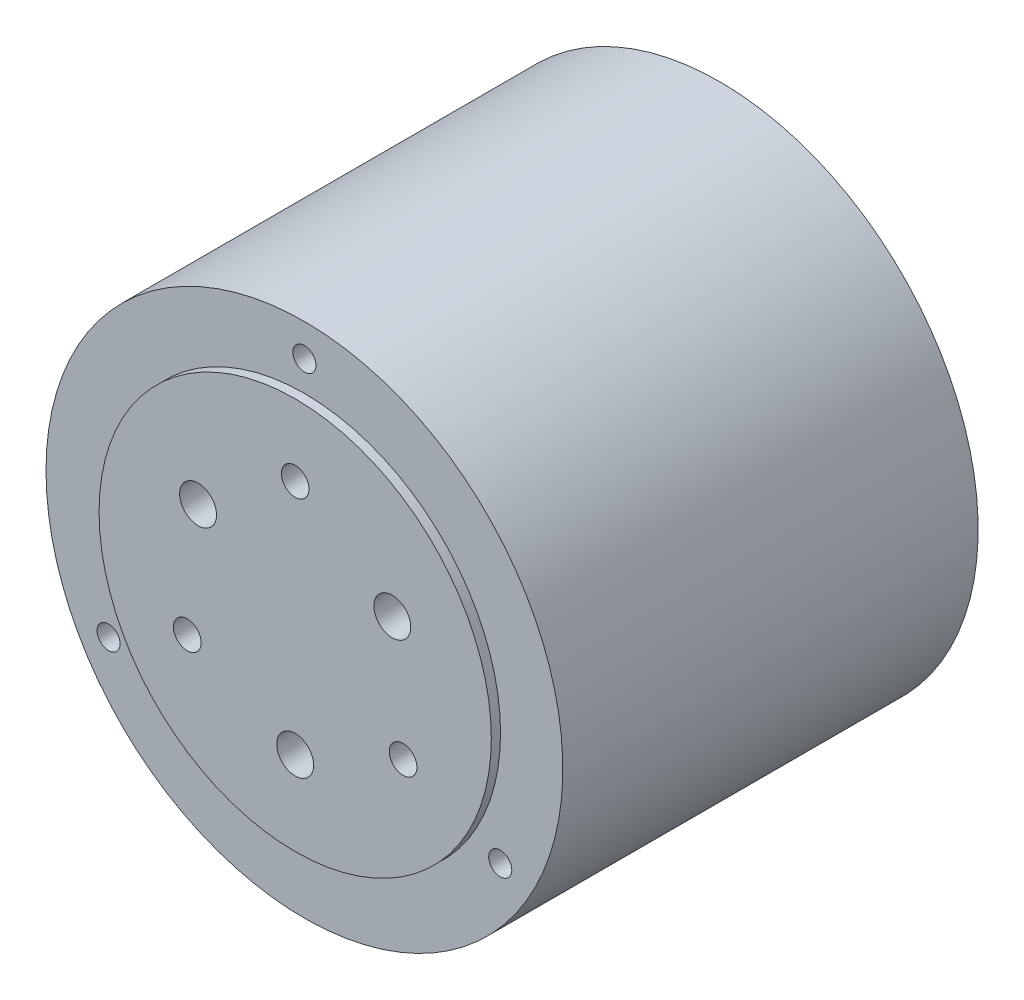
ISO-10303-21;
HEADER;
FILE_DESCRIPTION(('STEP AP214'),'2;1');
FILE_NAME('part.step','',(''),(''),'','','');
FILE_SCHEMA(('AUTOMOTIVE_DESIGN { 1 0 10303 214 1 1 1 1 }'));
ENDSEC;
DATA;
#1=APPLICATION_CONTEXT('core data for automotive mechanical design processes');
#2=APPLICATION_PROTOCOL_DEFINITION('international standard','automotive_design',2000,#1);
#3=PRODUCT_CONTEXT('',#1,'mechanical');
#4=PRODUCT('Part','Part','',(#3));
#5=PRODUCT_RELATED_PRODUCT_CATEGORY('part','',(#4));
#6=PRODUCT_DEFINITION_FORMATION('','',#4);
#7=PRODUCT_DEFINITION_CONTEXT('part definition',#1,'design');
#8=PRODUCT_DEFINITION('design','',#6,#7);
#9=PRODUCT_DEFINITION_SHAPE('','',#8);
#10=(LENGTH_UNIT() NAMED_UNIT(*) SI_UNIT(.MILLI.,.METRE.));
#11=(NAMED_UNIT(*) PLANE_ANGLE_UNIT() SI_UNIT($,.RADIAN.));
#12=(NAMED_UNIT(*) SI_UNIT($,.STERADIAN.) SOLID_ANGLE_UNIT());
#13=UNCERTAINTY_MEASURE_WITH_UNIT(LENGTH_MEASURE(1.E-05),#10,'distance_accuracy_value','');
#14=(GEOMETRIC_REPRESENTATION_CONTEXT(3) GLOBAL_UNCERTAINTY_ASSIGNED_CONTEXT((#13)) GLOBAL_UNIT_ASSIGNED_CONTEXT((#10,
#11,#12)) REPRESENTATION_CONTEXT('',''));
#15=CARTESIAN_POINT('',(0.,0.,0.));
#16=DIRECTION('',(0.,0.,1.));
#17=DIRECTION('',(1.,0.,0.));
#18=AXIS2_PLACEMENT_3D('',#15,#16,#17);
#19=CARTESIAN_POINT('',(0.,0.,45.));
#20=DIRECTION('',(0.,0.,-1.));
#21=DIRECTION('',(-1.,0.,0.));
#22=AXIS2_PLACEMENT_3D('',#19,#20,#21);
#23=CYLINDRICAL_SURFACE('',#22,28.);
#24=CARTESIAN_POINT('',(0.,0.,45.));
#25=DIRECTION('',(0.,0.,1.));
#26=DIRECTION('',(1.,0.,0.));
#27=AXIS2_PLACEMENT_3D('',#24,#25,#26);
#28=CIRCLE('',#27,28.);
#29=CARTESIAN_POINT('',(-28.,0.,45.));
#30=VERTEX_POINT('',#29);
#31=EDGE_CURVE('E10',#30,#30,#28,.T.);
#32=CARTESIAN_POINT('',(0.,0.,0.));
#33=DIRECTION('',(0.,0.,1.));
#34=DIRECTION('',(1.,0.,0.));
#35=AXIS2_PLACEMENT_3D('',#32,#33,#34);
#36=CIRCLE('',#35,28.);
#37=CARTESIAN_POINT('',(-28.,0.,0.));
#38=VERTEX_POINT('',#37);
#39=EDGE_CURVE('E44',#38,#38,#36,.T.);
#40=CARTESIAN_POINT('',(-28.,0.,45.));
#41=CARTESIAN_POINT('',(-28.,0.,44.53125));
#42=CARTESIAN_POINT('',(-28.,0.,44.0625));
#43=CARTESIAN_POINT('',(-28.,0.,43.125));
#44=CARTESIAN_POINT('',(-28.,0.,42.65625));
#45=CARTESIAN_POINT('',(-28.,0.,41.71875));
#46=CARTESIAN_POINT('',(-28.,0.,41.25));
#47=CARTESIAN_POINT('',(-28.,0.,40.3125));
#48=CARTESIAN_POINT('',(-28.,0.,39.84375));
#49=CARTESIAN_POINT('',(-28.,0.,38.90625));
#50=CARTESIAN_POINT('',(-28.,0.,38.4375));
#51=CARTESIAN_POINT('',(-28.,0.,37.5));
#52=CARTESIAN_POINT('',(-28.,0.,37.03125));
#53=CARTESIAN_POINT('',(-28.,0.,36.09375));
#54=CARTESIAN_POINT('',(-28.,0.,35.625));
#55=CARTESIAN_POINT('',(-28.,0.,34.6875));
#56=CARTESIAN_POINT('',(-28.,0.,34.21875));
#57=CARTESIAN_POINT('',(-28.,0.,33.28125));
#58=CARTESIAN_POINT('',(-28.,0.,32.8125));
#59=CARTESIAN_POINT('',(-28.,0.,31.875));
#60=CARTESIAN_POINT('',(-28.,0.,31.40625));
#61=CARTESIAN_POINT('',(-28.,0.,30.46875));
#62=CARTESIAN_POINT('',(-28.,0.,30.));
#63=CARTESIAN_POINT('',(-28.,0.,29.0625));
#64=CARTESIAN_POINT('',(-28.,0.,28.59375));
#65=CARTESIAN_POINT('',(-28.,0.,27.65625));
#66=CARTESIAN_POINT('',(-28.,0.,27.1875));
#67=CARTESIAN_POINT('',(-28.,0.,26.25));
#68=CARTESIAN_POINT('',(-28.,0.,25.78125));
#69=CARTESIAN_POINT('',(-28.,0.,24.84375));
#70=CARTESIAN_POINT('',(-28.,0.,24.375));
#71=CARTESIAN_POINT('',(-28.,0.,23.4375));
#72=CARTESIAN_POINT('',(-28.,0.,22.96875));
#73=CARTESIAN_POINT('',(-28.,0.,22.03125));
#74=CARTESIAN_POINT('',(-28.,0.,21.5625));
#75=CARTESIAN_POINT('',(-28.,0.,20.625));
#76=CARTESIAN_POINT('',(-28.,0.,20.15625));
#77=CARTESIAN_POINT('',(-28.,0.,19.21875));
#78=CARTESIAN_POINT('',(-28.,0.,18.75));
#79=CARTESIAN_POINT('',(-28.,0.,17.8125));
#80=CARTESIAN_POINT('',(-28.,0.,17.34375));
#81=CARTESIAN_POINT('',(-28.,0.,16.40625));
#82=CARTESIAN_POINT('',(-28.,0.,15.9375));
#83=CARTESIAN_POINT('',(-28.,0.,15.));
#84=CARTESIAN_POINT('',(-28.,0.,14.53125));
#85=CARTESIAN_POINT('',(-28.,0.,13.59375));
#86=CARTESIAN_POINT('',(-28.,0.,13.125));
#87=CARTESIAN_POINT('',(-28.,0.,12.1875));
#88=CARTESIAN_POINT('',(-28.,0.,11.71875));
#89=CARTESIAN_POINT('',(-28.,0.,10.78125));
#90=CARTESIAN_POINT('',(-28.,0.,10.3125));
#91=CARTESIAN_POINT('',(-28.,0.,9.37499999999999));
#92=CARTESIAN_POINT('',(-28.,0.,8.90624999999999));
#93=CARTESIAN_POINT('',(-28.,0.,7.96874999999999));
#94=CARTESIAN_POINT('',(-28.,0.,7.5));
#95=CARTESIAN_POINT('',(-28.,0.,6.56249999999999));
#96=CARTESIAN_POINT('',(-28.,0.,6.09374999999999));
#97=CARTESIAN_POINT('',(-28.,0.,5.15624999999999));
#98=CARTESIAN_POINT('',(-28.,0.,4.68749999999999));
#99=CARTESIAN_POINT('',(-28.,0.,3.74999999999999));
#100=CARTESIAN_POINT('',(-28.,0.,3.28124999999999));
#101=CARTESIAN_POINT('',(-28.,0.,2.34374999999999));
#102=CARTESIAN_POINT('',(-28.,0.,1.87499999999999));
#103=CARTESIAN_POINT('',(-28.,0.,0.937499999999992));
#104=CARTESIAN_POINT('',(-28.,0.,0.468749999999993));
#105=CARTESIAN_POINT('',(-28.,0.,0.));
#106=B_SPLINE_CURVE_WITH_KNOTS('',3,(#40,#41,#42,#43,#44,#45,#46,#47,#48,#49,#50,#51,#52,#53,
#54,#55,#56,#57,#58,#59,#60,#61,#62,#63,#64,#65,#66,#67,#68,#69,#70,#71,#72,#73,#74,#75,#76,#77,
#78,#79,#80,#81,#82,#83,#84,#85,#86,#87,#88,#89,#90,#91,#92,#93,#94,#95,#96,#97,#98,#99,#100,
#101,#102,#103,#104,#105),.UNSPECIFIED.,.F.,.F.,(4,2,2,2,2,2,2,2,2,2,2,2,2,2,2,2,2,2,2,2,2,2,2,
2,2,2,2,2,2,2,2,2,4),(0.,1.40625,2.8125,4.21874999999999,5.625,7.03125,8.43749999999999,9.84375,
11.25,12.65625,14.0625,15.46875,16.875,18.28125,19.6875,21.09375,22.5,23.90625,25.3125,26.71875,
28.125,29.53125,30.9375,32.34375,33.75,35.15625,36.5625,37.96875,39.375,40.78125,42.1875,
43.59375,45.),.UNSPECIFIED.);
#107=EDGE_CURVE('BSEAM41',#30,#38,#106,.T.);
#108=ORIENTED_EDGE('',*,*,#31,.F.);
#109=ORIENTED_EDGE('',*,*,#39,.T.);
#110=ORIENTED_EDGE('',*,*,#107,.T.);
#111=ORIENTED_EDGE('',*,*,#107,.F.);
#112=EDGE_LOOP('',(#108,#110,#109,#111));
#113=FACE_BOUND('',#112,.T.);
#114=ADVANCED_FACE('F41',(#113),#23,.T.);
#115=CARTESIAN_POINT('',(0.,0.,45.));
#116=DIRECTION('',(0.,0.,1.));
#117=DIRECTION('',(1.,0.,0.));
#118=AXIS2_PLACEMENT_3D('',#115,#116,#117);
#119=PLANE('',#118);
#120=CARTESIAN_POINT('',(0.,0.,45.));
#121=DIRECTION('',(0.,0.,1.));
#122=DIRECTION('',(1.,0.,0.));
#123=AXIS2_PLACEMENT_3D('',#120,#121,#122);
#124=CIRCLE('',#123,21.25);
#125=CARTESIAN_POINT('',(21.25,0.,45.));
#126=VERTEX_POINT('',#125);
#127=EDGE_CURVE('E111',#126,#126,#124,.T.);
#128=ORIENTED_EDGE('',*,*,#127,.F.);
#129=EDGE_LOOP('',(#128));
#130=FACE_BOUND('',#129,.T.);
#131=CARTESIAN_POINT('',(0.,24.5,45.));
#132=DIRECTION('',(0.,0.,1.));
#133=DIRECTION('',(1.,0.,0.));
#134=AXIS2_PLACEMENT_3D('',#131,#132,#133);
#135=CIRCLE('',#134,1.25);
#136=CARTESIAN_POINT('',(1.25,24.5,45.));
#137=VERTEX_POINT('',#136);
#138=EDGE_CURVE('E104',#137,#137,#135,.T.);
#139=ORIENTED_EDGE('',*,*,#138,.F.);
#140=EDGE_LOOP('',(#139));
#141=FACE_BOUND('',#140,.T.);
#142=CARTESIAN_POINT('',(21.2176223927188,-12.25,45.));
#143=DIRECTION('',(0.,0.,1.));
#144=DIRECTION('',(1.,0.,0.));
#145=AXIS2_PLACEMENT_3D('',#142,#143,#144);
#146=CIRCLE('',#145,1.25);
#147=CARTESIAN_POINT('',(22.4676223927188,-12.25,45.));
#148=VERTEX_POINT('',#147);
#149=EDGE_CURVE('E96',#148,#148,#146,.T.);
#150=ORIENTED_EDGE('',*,*,#149,.F.);
#151=EDGE_LOOP('',(#150));
#152=FACE_BOUND('',#151,.T.);
#153=CARTESIAN_POINT('',(-21.2176223927187,-12.25,45.));
#154=DIRECTION('',(0.,0.,1.));
#155=DIRECTION('',(1.,0.,0.));
#156=AXIS2_PLACEMENT_3D('',#153,#154,#155);
#157=CIRCLE('',#156,1.25);
#158=CARTESIAN_POINT('',(-19.9676223927187,-12.25,45.));
#159=VERTEX_POINT('',#158);
#160=EDGE_CURVE('E87',#159,#159,#157,.T.);
#161=ORIENTED_EDGE('',*,*,#160,.F.);
#162=EDGE_LOOP('',(#161));
#163=FACE_BOUND('',#162,.T.);
#164=ORIENTED_EDGE('',*,*,#31,.T.);
#165=EDGE_LOOP('',(#164));
#166=FACE_BOUND('',#165,.T.);
#167=ADVANCED_FACE('F200',(#130,#141,#152,#163,#166),#119,.T.);
#168=CARTESIAN_POINT('',(0.,0.,0.));
#169=DIRECTION('',(0.,0.,1.));
#170=DIRECTION('',(1.,0.,0.));
#171=AXIS2_PLACEMENT_3D('',#168,#169,#170);
#172=PLANE('',#171);
#173=CARTESIAN_POINT('',(-19.,0.,0.));
#174=DIRECTION('',(0.,0.,-1.));
#175=DIRECTION('',(-1.,0.,0.));
#176=AXIS2_PLACEMENT_3D('',#173,#174,#175);
#177=CIRCLE('',#176,1.25);
#178=CARTESIAN_POINT('',(-20.25,0.,0.));
#179=VERTEX_POINT('',#178);
#180=EDGE_CURVE('E80',#179,#179,#177,.T.);
#181=ORIENTED_EDGE('',*,*,#180,.F.);
#182=EDGE_LOOP('',(#181));
#183=FACE_BOUND('',#182,.T.);
#184=CARTESIAN_POINT('',(0.,-19.,0.));
#185=DIRECTION('',(0.,0.,-1.));
#186=DIRECTION('',(-1.,0.,0.));
#187=AXIS2_PLACEMENT_3D('',#184,#185,#186);
#188=CIRCLE('',#187,1.24999999999992);
#189=CARTESIAN_POINT('',(-1.24999999999992,-19.,0.));
#190=VERTEX_POINT('',#189);
#191=EDGE_CURVE('E72',#190,#190,#188,.T.);
#192=ORIENTED_EDGE('',*,*,#191,.F.);
#193=EDGE_LOOP('',(#192));
#194=FACE_BOUND('',#193,.T.);
#195=CARTESIAN_POINT('',(19.,1.32706345912226E-13,0.));
#196=DIRECTION('',(0.,0.,-1.));
#197=DIRECTION('',(-1.,0.,0.));
#198=AXIS2_PLACEMENT_3D('',#195,#196,#197);
#199=CIRCLE('',#198,1.25);
#200=CARTESIAN_POINT('',(17.75,1.32706345912226E-13,0.));
#201=VERTEX_POINT('',#200);
#202=EDGE_CURVE('E64',#201,#201,#199,.T.);
#203=ORIENTED_EDGE('',*,*,#202,.F.);
#204=EDGE_LOOP('',(#203));
#205=FACE_BOUND('',#204,.T.);
#206=CARTESIAN_POINT('',(-1.99059518868339E-13,19.,0.));
#207=DIRECTION('',(0.,0.,-1.));
#208=DIRECTION('',(-1.,0.,0.));
#209=AXIS2_PLACEMENT_3D('',#206,#207,#208);
#210=CIRCLE('',#209,1.25);
#211=CARTESIAN_POINT('',(-1.2500000000002,19.,0.));
#212=VERTEX_POINT('',#211);
#213=EDGE_CURVE('E55',#212,#212,#210,.T.);
#214=ORIENTED_EDGE('',*,*,#213,.F.);
#215=EDGE_LOOP('',(#214));
#216=FACE_BOUND('',#215,.T.);
#217=ORIENTED_EDGE('',*,*,#39,.F.);
#218=EDGE_LOOP('',(#217));
#219=FACE_BOUND('',#218,.T.);
#220=ADVANCED_FACE('F203',(#183,#194,#205,#216,#219),#172,.F.);
#221=CARTESIAN_POINT('',(-1.99059518868339E-13,19.,4.));
#222=DIRECTION('',(0.,0.,-1.));
#223=DIRECTION('',(-1.,0.,0.));
#224=AXIS2_PLACEMENT_3D('',#221,#222,#223);
#225=CYLINDRICAL_SURFACE('',#224,1.25);
#226=CARTESIAN_POINT('',(-1.99059518868339E-13,19.,4.));
#227=DIRECTION('',(0.,0.,-1.));
#228=DIRECTION('',(-1.,0.,0.));
#229=AXIS2_PLACEMENT_3D('',#226,#227,#228);
#230=CIRCLE('',#229,1.25);
#231=CARTESIAN_POINT('',(-1.2500000000002,19.,4.));
#232=VERTEX_POINT('',#231);
#233=EDGE_CURVE('E59',#232,#232,#230,.T.);
#234=ORIENTED_EDGE('',*,*,#233,.F.);
#235=EDGE_LOOP('',(#234));
#236=FACE_BOUND('',#235,.T.);
#237=ORIENTED_EDGE('',*,*,#213,.T.);
#238=EDGE_LOOP('',(#237));
#239=FACE_BOUND('',#238,.T.);
#240=ADVANCED_FACE('F236',(#236,#239),#225,.F.);
#241=CARTESIAN_POINT('',(-1.99059518868339E-13,19.,4.));
#242=DIRECTION('',(0.,0.,-1.));
#243=DIRECTION('',(-1.,0.,0.));
#244=AXIS2_PLACEMENT_3D('',#241,#242,#243);
#245=PLANE('',#244);
#246=ORIENTED_EDGE('',*,*,#233,.T.);
#247=EDGE_LOOP('',(#246));
#248=FACE_BOUND('',#247,.T.);
#249=ADVANCED_FACE('F241',(#248),#245,.T.);
#250=CARTESIAN_POINT('',(19.,1.32706345912226E-13,4.));
#251=DIRECTION('',(0.,0.,-1.));
#252=DIRECTION('',(-1.,0.,0.));
#253=AXIS2_PLACEMENT_3D('',#250,#251,#252);
#254=CYLINDRICAL_SURFACE('',#253,1.25);
#255=CARTESIAN_POINT('',(19.,1.32706345912226E-13,4.));
#256=DIRECTION('',(0.,0.,-1.));
#257=DIRECTION('',(-1.,0.,0.));
#258=AXIS2_PLACEMENT_3D('',#255,#256,#257);
#259=CIRCLE('',#258,1.25);
#260=CARTESIAN_POINT('',(17.75,1.32706345912226E-13,4.));
#261=VERTEX_POINT('',#260);
#262=EDGE_CURVE('E68',#261,#261,#259,.T.);
#263=ORIENTED_EDGE('',*,*,#262,.F.);
#264=EDGE_LOOP('',(#263));
#265=FACE_BOUND('',#264,.T.);
#266=ORIENTED_EDGE('',*,*,#202,.T.);
#267=EDGE_LOOP('',(#266));
#268=FACE_BOUND('',#267,.T.);
#269=ADVANCED_FACE('F249',(#265,#268),#254,.F.);
#270=CARTESIAN_POINT('',(19.,1.32706345912226E-13,4.));
#271=DIRECTION('',(0.,0.,-1.));
#272=DIRECTION('',(-1.,0.,0.));
#273=AXIS2_PLACEMENT_3D('',#270,#271,#272);
#274=PLANE('',#273);
#275=ORIENTED_EDGE('',*,*,#262,.T.);
#276=EDGE_LOOP('',(#275));
#277=FACE_BOUND('',#276,.T.);
#278=ADVANCED_FACE('F253',(#277),#274,.T.);
#279=CARTESIAN_POINT('',(0.,-19.,4.));
#280=DIRECTION('',(0.,0.,-1.));
#281=DIRECTION('',(-1.,0.,0.));
#282=AXIS2_PLACEMENT_3D('',#279,#280,#281);
#283=CYLINDRICAL_SURFACE('',#282,1.24999999999992);
#284=CARTESIAN_POINT('',(0.,-19.,4.));
#285=DIRECTION('',(0.,0.,-1.));
#286=DIRECTION('',(-1.,0.,0.));
#287=AXIS2_PLACEMENT_3D('',#284,#285,#286);
#288=CIRCLE('',#287,1.24999999999992);
#289=CARTESIAN_POINT('',(-1.24999999999992,-19.,4.));
#290=VERTEX_POINT('',#289);
#291=EDGE_CURVE('E76',#290,#290,#288,.T.);
#292=ORIENTED_EDGE('',*,*,#291,.F.);
#293=EDGE_LOOP('',(#292));
#294=FACE_BOUND('',#293,.T.);
#295=ORIENTED_EDGE('',*,*,#191,.T.);
#296=EDGE_LOOP('',(#295));
#297=FACE_BOUND('',#296,.T.);
#298=ADVANCED_FACE('F257',(#294,#297),#283,.F.);
#299=CARTESIAN_POINT('',(0.,-19.,4.));
#300=DIRECTION('',(0.,0.,-1.));
#301=DIRECTION('',(-1.,0.,0.));
#302=AXIS2_PLACEMENT_3D('',#299,#300,#301);
#303=PLANE('',#302);
#304=ORIENTED_EDGE('',*,*,#291,.T.);
#305=EDGE_LOOP('',(#304));
#306=FACE_BOUND('',#305,.T.);
#307=ADVANCED_FACE('F261',(#306),#303,.T.);
#308=CARTESIAN_POINT('',(-19.,0.,4.));
#309=DIRECTION('',(0.,0.,-1.));
#310=DIRECTION('',(-1.,0.,0.));
#311=AXIS2_PLACEMENT_3D('',#308,#309,#310);
#312=CYLINDRICAL_SURFACE('',#311,1.25);
#313=CARTESIAN_POINT('',(-19.,0.,4.));
#314=DIRECTION('',(0.,0.,-1.));
#315=DIRECTION('',(-1.,0.,0.));
#316=AXIS2_PLACEMENT_3D('',#313,#314,#315);
#317=CIRCLE('',#316,1.25);
#318=CARTESIAN_POINT('',(-20.25,0.,4.));
#319=VERTEX_POINT('',#318);
#320=EDGE_CURVE('E53',#319,#319,#317,.T.);
#321=ORIENTED_EDGE('',*,*,#320,.F.);
#322=EDGE_LOOP('',(#321));
#323=FACE_BOUND('',#322,.T.);
#324=ORIENTED_EDGE('',*,*,#180,.T.);
#325=EDGE_LOOP('',(#324));
#326=FACE_BOUND('',#325,.T.);
#327=ADVANCED_FACE('F224',(#323,#326),#312,.F.);
#328=CARTESIAN_POINT('',(-19.,0.,4.));
#329=DIRECTION('',(0.,0.,-1.));
#330=DIRECTION('',(-1.,0.,0.));
#331=AXIS2_PLACEMENT_3D('',#328,#329,#330);
#332=PLANE('',#331);
#333=ORIENTED_EDGE('',*,*,#320,.T.);
#334=EDGE_LOOP('',(#333));
#335=FACE_BOUND('',#334,.T.);
#336=ADVANCED_FACE('F214',(#335),#332,.T.);
#337=CARTESIAN_POINT('',(-21.2176223927187,-12.25,40.));
#338=DIRECTION('',(0.,0.,1.));
#339=DIRECTION('',(1.,0.,0.));
#340=AXIS2_PLACEMENT_3D('',#337,#338,#339);
#341=CYLINDRICAL_SURFACE('',#340,1.25);
#342=CARTESIAN_POINT('',(-21.2176223927187,-12.25,40.));
#343=DIRECTION('',(0.,0.,1.));
#344=DIRECTION('',(1.,0.,0.));
#345=AXIS2_PLACEMENT_3D('',#342,#343,#344);
#346=CIRCLE('',#345,1.25);
#347=CARTESIAN_POINT('',(-19.9676223927187,-12.25,40.));
#348=VERTEX_POINT('',#347);
#349=EDGE_CURVE('E91',#348,#348,#346,.T.);
#350=ORIENTED_EDGE('',*,*,#349,.F.);
#351=EDGE_LOOP('',(#350));
#352=FACE_BOUND('',#351,.T.);
#353=ORIENTED_EDGE('',*,*,#160,.T.);
#354=EDGE_LOOP('',(#353));
#355=FACE_BOUND('',#354,.T.);
#356=ADVANCED_FACE('F211',(#352,#355),#341,.F.);
#357=CARTESIAN_POINT('',(-21.2176223927187,-12.25,40.));
#358=DIRECTION('',(0.,0.,1.));
#359=DIRECTION('',(1.,0.,0.));
#360=AXIS2_PLACEMENT_3D('',#357,#358,#359);
#361=PLANE('',#360);
#362=ORIENTED_EDGE('',*,*,#349,.T.);
#363=EDGE_LOOP('',(#362));
#364=FACE_BOUND('',#363,.T.);
#365=ADVANCED_FACE('F213',(#364),#361,.T.);
#366=CARTESIAN_POINT('',(21.2176223927188,-12.25,40.));
#367=DIRECTION('',(0.,0.,1.));
#368=DIRECTION('',(1.,0.,0.));
#369=AXIS2_PLACEMENT_3D('',#366,#367,#368);
#370=CYLINDRICAL_SURFACE('',#369,1.25);
#371=CARTESIAN_POINT('',(21.2176223927188,-12.25,40.));
#372=DIRECTION('',(0.,0.,1.));
#373=DIRECTION('',(1.,0.,0.));
#374=AXIS2_PLACEMENT_3D('',#371,#372,#373);
#375=CIRCLE('',#374,1.25);
#376=CARTESIAN_POINT('',(22.4676223927188,-12.25,40.));
#377=VERTEX_POINT('',#376);
#378=EDGE_CURVE('E100',#377,#377,#375,.T.);
#379=ORIENTED_EDGE('',*,*,#378,.F.);
#380=EDGE_LOOP('',(#379));
#381=FACE_BOUND('',#380,.T.);
#382=ORIENTED_EDGE('',*,*,#149,.T.);
#383=EDGE_LOOP('',(#382));
#384=FACE_BOUND('',#383,.T.);
#385=ADVANCED_FACE('F221',(#381,#384),#370,.F.);
#386=CARTESIAN_POINT('',(21.2176223927188,-12.25,40.));
#387=DIRECTION('',(0.,0.,1.));
#388=DIRECTION('',(1.,0.,0.));
#389=AXIS2_PLACEMENT_3D('',#386,#387,#388);
#390=PLANE('',#389);
#391=ORIENTED_EDGE('',*,*,#378,.T.);
#392=EDGE_LOOP('',(#391));
#393=FACE_BOUND('',#392,.T.);
#394=ADVANCED_FACE('F291',(#393),#390,.T.);
#395=CARTESIAN_POINT('',(0.,24.5,40.));
#396=DIRECTION('',(0.,0.,1.));
#397=DIRECTION('',(1.,0.,0.));
#398=AXIS2_PLACEMENT_3D('',#395,#396,#397);
#399=CYLINDRICAL_SURFACE('',#398,1.25);
#400=CARTESIAN_POINT('',(0.,24.5,40.));
#401=DIRECTION('',(0.,0.,1.));
#402=DIRECTION('',(1.,0.,0.));
#403=AXIS2_PLACEMENT_3D('',#400,#401,#402);
#404=CIRCLE('',#403,1.25);
#405=CARTESIAN_POINT('',(1.25,24.5,40.));
#406=VERTEX_POINT('',#405);
#407=EDGE_CURVE('E60',#406,#406,#404,.T.);
#408=ORIENTED_EDGE('',*,*,#407,.F.);
#409=EDGE_LOOP('',(#408));
#410=FACE_BOUND('',#409,.T.);
#411=ORIENTED_EDGE('',*,*,#138,.T.);
#412=EDGE_LOOP('',(#411));
#413=FACE_BOUND('',#412,.T.);
#414=ADVANCED_FACE('F299',(#410,#413),#399,.F.);
#415=CARTESIAN_POINT('',(0.,24.5,40.));
#416=DIRECTION('',(0.,0.,1.));
#417=DIRECTION('',(1.,0.,0.));
#418=AXIS2_PLACEMENT_3D('',#415,#416,#417);
#419=PLANE('',#418);
#420=ORIENTED_EDGE('',*,*,#407,.T.);
#421=EDGE_LOOP('',(#420));
#422=FACE_BOUND('',#421,.T.);
#423=ADVANCED_FACE('F196',(#422),#419,.T.);
#424=CARTESIAN_POINT('',(0.,0.,46.));
#425=DIRECTION('',(0.,0.,-1.));
#426=DIRECTION('',(-1.,0.,0.));
#427=AXIS2_PLACEMENT_3D('',#424,#425,#426);
#428=CYLINDRICAL_SURFACE('',#427,21.25);
#429=CARTESIAN_POINT('',(0.,0.,46.));
#430=DIRECTION('',(0.,0.,1.));
#431=DIRECTION('',(1.,0.,0.));
#432=AXIS2_PLACEMENT_3D('',#429,#430,#431);
#433=CIRCLE('',#432,21.25);
#434=CARTESIAN_POINT('',(21.25,0.,46.));
#435=VERTEX_POINT('',#434);
#436=EDGE_CURVE('E92',#435,#435,#433,.T.);
#437=ORIENTED_EDGE('',*,*,#436,.F.);
#438=EDGE_LOOP('',(#437));
#439=FACE_BOUND('',#438,.T.);
#440=ORIENTED_EDGE('',*,*,#127,.T.);
#441=EDGE_LOOP('',(#440));
#442=FACE_BOUND('',#441,.T.);
#443=ADVANCED_FACE('F180',(#439,#442),#428,.T.);
#444=CARTESIAN_POINT('',(0.,0.,46.));
#445=DIRECTION('',(0.,0.,1.));
#446=DIRECTION('',(1.,0.,0.));
#447=AXIS2_PLACEMENT_3D('',#444,#445,#446);
#448=PLANE('',#447);
#449=CARTESIAN_POINT('',(0.,-12.15,46.));
#450=DIRECTION('',(0.,0.,1.));
#451=DIRECTION('',(1.,0.,0.));
#452=AXIS2_PLACEMENT_3D('',#449,#450,#451);
#453=CIRCLE('',#452,2.);
#454=CARTESIAN_POINT('',(2.,-12.15,46.));
#455=VERTEX_POINT('',#454);
#456=EDGE_CURVE('E159',#455,#455,#453,.T.);
#457=ORIENTED_EDGE('',*,*,#456,.F.);
#458=EDGE_LOOP('',(#457));
#459=FACE_BOUND('',#458,.T.);
#460=CARTESIAN_POINT('',(-10.5222086559809,6.075,46.));
#461=DIRECTION('',(0.,0.,1.));
#462=DIRECTION('',(1.,0.,0.));
#463=AXIS2_PLACEMENT_3D('',#460,#461,#462);
#464=CIRCLE('',#463,2.);
#465=CARTESIAN_POINT('',(-8.52220865598093,6.075,46.));
#466=VERTEX_POINT('',#465);
#467=EDGE_CURVE('E151',#466,#466,#464,.T.);
#468=ORIENTED_EDGE('',*,*,#467,.F.);
#469=EDGE_LOOP('',(#468));
#470=FACE_BOUND('',#469,.T.);
#471=CARTESIAN_POINT('',(10.5222086559809,6.07500000000001,46.));
#472=DIRECTION('',(0.,0.,1.));
#473=DIRECTION('',(1.,0.,0.));
#474=AXIS2_PLACEMENT_3D('',#471,#472,#473);
#475=CIRCLE('',#474,2.);
#476=CARTESIAN_POINT('',(12.5222086559809,6.07500000000001,46.));
#477=VERTEX_POINT('',#476);
#478=EDGE_CURVE('E143',#477,#477,#475,.T.);
#479=ORIENTED_EDGE('',*,*,#478,.F.);
#480=EDGE_LOOP('',(#479));
#481=FACE_BOUND('',#480,.T.);
#482=CARTESIAN_POINT('',(0.,13.5,46.));
#483=DIRECTION('',(0.,0.,1.));
#484=DIRECTION('',(1.,0.,0.));
#485=AXIS2_PLACEMENT_3D('',#482,#483,#484);
#486=CIRCLE('',#485,1.5);
#487=CARTESIAN_POINT('',(1.5,13.5,46.));
#488=VERTEX_POINT('',#487);
#489=EDGE_CURVE('E136',#488,#488,#486,.T.);
#490=ORIENTED_EDGE('',*,*,#489,.F.);
#491=EDGE_LOOP('',(#490));
#492=FACE_BOUND('',#491,.T.);
#493=CARTESIAN_POINT('',(11.6913429510899,-6.75,46.));
#494=DIRECTION('',(0.,0.,1.));
#495=DIRECTION('',(1.,0.,0.));
#496=AXIS2_PLACEMENT_3D('',#493,#494,#495);
#497=CIRCLE('',#496,1.5);
#498=CARTESIAN_POINT('',(13.1913429510899,-6.75,46.));
#499=VERTEX_POINT('',#498);
#500=EDGE_CURVE('E128',#499,#499,#497,.T.);
#501=ORIENTED_EDGE('',*,*,#500,.F.);
#502=EDGE_LOOP('',(#501));
#503=FACE_BOUND('',#502,.T.);
#504=CARTESIAN_POINT('',(-11.6913429510899,-6.75000000000001,46.));
#505=DIRECTION('',(0.,0.,1.));
#506=DIRECTION('',(1.,0.,0.));
#507=AXIS2_PLACEMENT_3D('',#504,#505,#506);
#508=CIRCLE('',#507,1.5);
#509=CARTESIAN_POINT('',(-10.1913429510899,-6.75000000000001,46.));
#510=VERTEX_POINT('',#509);
#511=EDGE_CURVE('E119',#510,#510,#508,.T.);
#512=ORIENTED_EDGE('',*,*,#511,.F.);
#513=EDGE_LOOP('',(#512));
#514=FACE_BOUND('',#513,.T.);
#515=ORIENTED_EDGE('',*,*,#436,.T.);
#516=EDGE_LOOP('',(#515));
#517=FACE_BOUND('',#516,.T.);
#518=ADVANCED_FACE('F176',(#459,#470,#481,#492,#503,#514,#517),#448,.T.);
#519=CARTESIAN_POINT('',(-11.6913429510899,-6.75000000000001,41.));
#520=DIRECTION('',(0.,0.,1.));
#521=DIRECTION('',(1.,0.,0.));
#522=AXIS2_PLACEMENT_3D('',#519,#520,#521);
#523=CYLINDRICAL_SURFACE('',#522,1.5);
#524=CARTESIAN_POINT('',(-11.6913429510899,-6.75000000000001,41.));
#525=DIRECTION('',(0.,0.,1.));
#526=DIRECTION('',(1.,0.,0.));
#527=AXIS2_PLACEMENT_3D('',#524,#525,#526);
#528=CIRCLE('',#527,1.5);
#529=CARTESIAN_POINT('',(-10.1913429510899,-6.75000000000001,41.));
#530=VERTEX_POINT('',#529);
#531=EDGE_CURVE('E123',#530,#530,#528,.T.);
#532=ORIENTED_EDGE('',*,*,#531,.F.);
#533=EDGE_LOOP('',(#532));
#534=FACE_BOUND('',#533,.T.);
#535=ORIENTED_EDGE('',*,*,#511,.T.);
#536=EDGE_LOOP('',(#535));
#537=FACE_BOUND('',#536,.T.);
#538=ADVANCED_FACE('F179',(#534,#537),#523,.F.);
#539=CARTESIAN_POINT('',(-11.6913429510899,-6.75000000000001,41.));
#540=DIRECTION('',(0.,0.,1.));
#541=DIRECTION('',(1.,0.,0.));
#542=AXIS2_PLACEMENT_3D('',#539,#540,#541);
#543=PLANE('',#542);
#544=ORIENTED_EDGE('',*,*,#531,.T.);
#545=EDGE_LOOP('',(#544));
#546=FACE_BOUND('',#545,.T.);
#547=ADVANCED_FACE('F331',(#546),#543,.T.);
#548=CARTESIAN_POINT('',(11.6913429510899,-6.75,41.));
#549=DIRECTION('',(0.,0.,1.));
#550=DIRECTION('',(1.,0.,0.));
#551=AXIS2_PLACEMENT_3D('',#548,#549,#550);
#552=CYLINDRICAL_SURFACE('',#551,1.5);
#553=CARTESIAN_POINT('',(11.6913429510899,-6.75,41.));
#554=DIRECTION('',(0.,0.,1.));
#555=DIRECTION('',(1.,0.,0.));
#556=AXIS2_PLACEMENT_3D('',#553,#554,#555);
#557=CIRCLE('',#556,1.5);
#558=CARTESIAN_POINT('',(13.1913429510899,-6.75,41.));
#559=VERTEX_POINT('',#558);
#560=EDGE_CURVE('E132',#559,#559,#557,.T.);
#561=ORIENTED_EDGE('',*,*,#560,.F.);
#562=EDGE_LOOP('',(#561));
#563=FACE_BOUND('',#562,.T.);
#564=ORIENTED_EDGE('',*,*,#500,.T.);
#565=EDGE_LOOP('',(#564));
#566=FACE_BOUND('',#565,.T.);
#567=ADVANCED_FACE('F339',(#563,#566),#552,.F.);
#568=CARTESIAN_POINT('',(11.6913429510899,-6.75,41.));
#569=DIRECTION('',(0.,0.,1.));
#570=DIRECTION('',(1.,0.,0.));
#571=AXIS2_PLACEMENT_3D('',#568,#569,#570);
#572=PLANE('',#571);
#573=ORIENTED_EDGE('',*,*,#560,.T.);
#574=EDGE_LOOP('',(#573));
#575=FACE_BOUND('',#574,.T.);
#576=ADVANCED_FACE('F347',(#575),#572,.T.);
#577=CARTESIAN_POINT('',(0.,13.5,41.));
#578=DIRECTION('',(0.,0.,1.));
#579=DIRECTION('',(1.,0.,0.));
#580=AXIS2_PLACEMENT_3D('',#577,#578,#579);
#581=CYLINDRICAL_SURFACE('',#580,1.5);
#582=CARTESIAN_POINT('',(0.,13.5,41.));
#583=DIRECTION('',(0.,0.,1.));
#584=DIRECTION('',(1.,0.,0.));
#585=AXIS2_PLACEMENT_3D('',#582,#583,#584);
#586=CIRCLE('',#585,1.5);
#587=CARTESIAN_POINT('',(1.5,13.5,41.));
#588=VERTEX_POINT('',#587);
#589=EDGE_CURVE('E115',#588,#588,#586,.T.);
#590=ORIENTED_EDGE('',*,*,#589,.F.);
#591=EDGE_LOOP('',(#590));
#592=FACE_BOUND('',#591,.T.);
#593=ORIENTED_EDGE('',*,*,#489,.T.);
#594=EDGE_LOOP('',(#593));
#595=FACE_BOUND('',#594,.T.);
#596=ADVANCED_FACE('F355',(#592,#595),#581,.F.);
#597=CARTESIAN_POINT('',(0.,13.5,41.));
#598=DIRECTION('',(0.,0.,1.));
#599=DIRECTION('',(1.,0.,0.));
#600=AXIS2_PLACEMENT_3D('',#597,#598,#599);
#601=PLANE('',#600);
#602=ORIENTED_EDGE('',*,*,#589,.T.);
#603=EDGE_LOOP('',(#602));
#604=FACE_BOUND('',#603,.T.);
#605=ADVANCED_FACE('F363',(#604),#601,.T.);
#606=CARTESIAN_POINT('',(10.5222086559809,6.07500000000001,41.));
#607=DIRECTION('',(0.,0.,1.));
#608=DIRECTION('',(1.,0.,0.));
#609=AXIS2_PLACEMENT_3D('',#606,#607,#608);
#610=CYLINDRICAL_SURFACE('',#609,2.);
#611=CARTESIAN_POINT('',(10.5222086559809,6.07500000000001,41.));
#612=DIRECTION('',(0.,0.,1.));
#613=DIRECTION('',(1.,0.,0.));
#614=AXIS2_PLACEMENT_3D('',#611,#612,#613);
#615=CIRCLE('',#614,2.);
#616=CARTESIAN_POINT('',(12.5222086559809,6.07500000000001,41.));
#617=VERTEX_POINT('',#616);
#618=EDGE_CURVE('E147',#617,#617,#615,.T.);
#619=ORIENTED_EDGE('',*,*,#618,.F.);
#620=EDGE_LOOP('',(#619));
#621=FACE_BOUND('',#620,.T.);
#622=ORIENTED_EDGE('',*,*,#478,.T.);
#623=EDGE_LOOP('',(#622));
#624=FACE_BOUND('',#623,.T.);
#625=ADVANCED_FACE('F370',(#621,#624),#610,.F.);
#626=CARTESIAN_POINT('',(10.5222086559809,6.07500000000001,41.));
#627=DIRECTION('',(0.,0.,1.));
#628=DIRECTION('',(1.,0.,0.));
#629=AXIS2_PLACEMENT_3D('',#626,#627,#628);
#630=PLANE('',#629);
#631=ORIENTED_EDGE('',*,*,#618,.T.);
#632=EDGE_LOOP('',(#631));
#633=FACE_BOUND('',#632,.T.);
#634=ADVANCED_FACE('F377',(#633),#630,.T.);
#635=CARTESIAN_POINT('',(-10.5222086559809,6.075,41.));
#636=DIRECTION('',(0.,0.,1.));
#637=DIRECTION('',(1.,0.,0.));
#638=AXIS2_PLACEMENT_3D('',#635,#636,#637);
#639=CYLINDRICAL_SURFACE('',#638,2.);
#640=CARTESIAN_POINT('',(-10.5222086559809,6.075,41.));
#641=DIRECTION('',(0.,0.,1.));
#642=DIRECTION('',(1.,0.,0.));
#643=AXIS2_PLACEMENT_3D('',#640,#641,#642);
#644=CIRCLE('',#643,2.);
#645=CARTESIAN_POINT('',(-8.52220865598093,6.075,41.));
#646=VERTEX_POINT('',#645);
#647=EDGE_CURVE('E155',#646,#646,#644,.T.);
#648=ORIENTED_EDGE('',*,*,#647,.F.);
#649=EDGE_LOOP('',(#648));
#650=FACE_BOUND('',#649,.T.);
#651=ORIENTED_EDGE('',*,*,#467,.T.);
#652=EDGE_LOOP('',(#651));
#653=FACE_BOUND('',#652,.T.);
#654=ADVANCED_FACE('F385',(#650,#653),#639,.F.);
#655=CARTESIAN_POINT('',(-10.5222086559809,6.075,41.));
#656=DIRECTION('',(0.,0.,1.));
#657=DIRECTION('',(1.,0.,0.));
#658=AXIS2_PLACEMENT_3D('',#655,#656,#657);
#659=PLANE('',#658);
#660=ORIENTED_EDGE('',*,*,#647,.T.);
#661=EDGE_LOOP('',(#660));
#662=FACE_BOUND('',#661,.T.);
#663=ADVANCED_FACE('F172',(#662),#659,.T.);
#664=CARTESIAN_POINT('',(0.,-12.15,41.));
#665=DIRECTION('',(0.,0.,1.));
#666=DIRECTION('',(1.,0.,0.));
#667=AXIS2_PLACEMENT_3D('',#664,#665,#666);
#668=CYLINDRICAL_SURFACE('',#667,2.);
#669=CARTESIAN_POINT('',(0.,-12.15,41.));
#670=DIRECTION('',(0.,0.,1.));
#671=DIRECTION('',(1.,0.,0.));
#672=AXIS2_PLACEMENT_3D('',#669,#670,#671);
#673=CIRCLE('',#672,2.);
#674=CARTESIAN_POINT('',(2.,-12.15,41.));
#675=VERTEX_POINT('',#674);
#676=EDGE_CURVE('E124',#675,#675,#673,.T.);
#677=ORIENTED_EDGE('',*,*,#676,.F.);
#678=EDGE_LOOP('',(#677));
#679=FACE_BOUND('',#678,.T.);
#680=ORIENTED_EDGE('',*,*,#456,.T.);
#681=EDGE_LOOP('',(#680));
#682=FACE_BOUND('',#681,.T.);
#683=ADVANCED_FACE('F169',(#679,#682),#668,.F.);
#684=CARTESIAN_POINT('',(0.,-12.15,41.));
#685=DIRECTION('',(0.,0.,1.));
#686=DIRECTION('',(1.,0.,0.));
#687=AXIS2_PLACEMENT_3D('',#684,#685,#686);
#688=PLANE('',#687);
#689=ORIENTED_EDGE('',*,*,#676,.T.);
#690=EDGE_LOOP('',(#689));
#691=FACE_BOUND('',#690,.T.);
#692=ADVANCED_FACE('F167',(#691),#688,.T.);
#693=CLOSED_SHELL('',(#114,#167,#220,#240,#249,#269,#278,#298,#307,#327,#336,#356,#365,#385,
#394,#414,#423,#443,#518,#538,#547,#567,#576,#596,#605,#625,#634,#654,#663,#683,#692));
#694=MANIFOLD_SOLID_BREP('B2',#693);
#695=ADVANCED_BREP_SHAPE_REPRESENTATION('',(#18,#694),#14);
#696=SHAPE_DEFINITION_REPRESENTATION(#9,#695);
ENDSEC;
END-ISO-10303-21;
